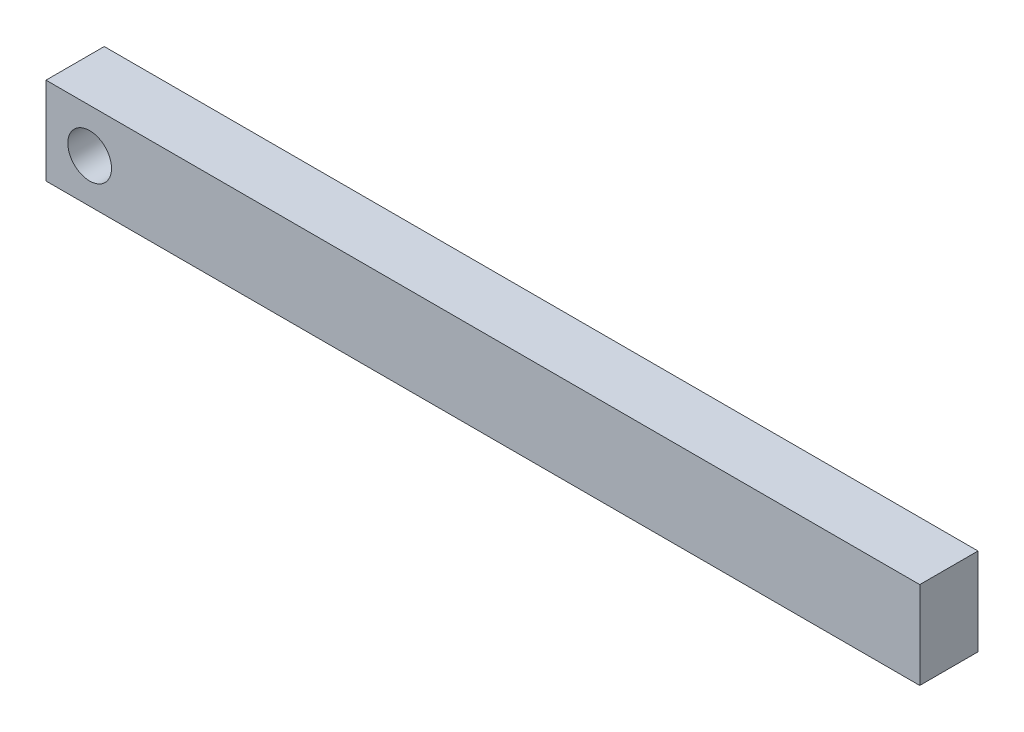
ISO-10303-21;
HEADER;
FILE_DESCRIPTION(('STEP AP214'),'2;1');
FILE_NAME('part.step','',(''),(''),'','','');
FILE_SCHEMA(('AUTOMOTIVE_DESIGN { 1 0 10303 214 1 1 1 1 }'));
ENDSEC;
DATA;
#1=APPLICATION_CONTEXT('core data for automotive mechanical design processes');
#2=APPLICATION_PROTOCOL_DEFINITION('international standard','automotive_design',2000,#1);
#3=PRODUCT_CONTEXT('',#1,'mechanical');
#4=PRODUCT('Part','Part','',(#3));
#5=PRODUCT_RELATED_PRODUCT_CATEGORY('part','',(#4));
#6=PRODUCT_DEFINITION_FORMATION('','',#4);
#7=PRODUCT_DEFINITION_CONTEXT('part definition',#1,'design');
#8=PRODUCT_DEFINITION('design','',#6,#7);
#9=PRODUCT_DEFINITION_SHAPE('','',#8);
#10=(LENGTH_UNIT() NAMED_UNIT(*) SI_UNIT(.MILLI.,.METRE.));
#11=(NAMED_UNIT(*) PLANE_ANGLE_UNIT() SI_UNIT($,.RADIAN.));
#12=(NAMED_UNIT(*) SI_UNIT($,.STERADIAN.) SOLID_ANGLE_UNIT());
#13=UNCERTAINTY_MEASURE_WITH_UNIT(LENGTH_MEASURE(1.E-05),#10,'distance_accuracy_value','');
#14=(GEOMETRIC_REPRESENTATION_CONTEXT(3) GLOBAL_UNCERTAINTY_ASSIGNED_CONTEXT((#13)) GLOBAL_UNIT_ASSIGNED_CONTEXT((#10,
#11,#12)) REPRESENTATION_CONTEXT('',''));
#15=CARTESIAN_POINT('',(0.,0.,0.));
#16=DIRECTION('',(0.,0.,1.));
#17=DIRECTION('',(1.,0.,0.));
#18=AXIS2_PLACEMENT_3D('',#15,#16,#17);
#19=CARTESIAN_POINT('',(-381.,-38.1000000000001,50.8));
#20=DIRECTION('',(1.,0.,0.));
#21=DIRECTION('',(0.,0.,-1.));
#22=AXIS2_PLACEMENT_3D('',#19,#20,#21);
#23=PLANE('',#22);
#24=DIRECTION('',(0.,-1.,0.));
#25=VECTOR('',#24,1.);
#26=CARTESIAN_POINT('',(-381.,-38.1000000000001,0.));
#27=LINE('',#26,#25);
#28=CARTESIAN_POINT('',(-381.,38.1,0.));
#29=VERTEX_POINT('',#28);
#30=CARTESIAN_POINT('',(-381.,-38.1000000000001,0.));
#31=VERTEX_POINT('',#30);
#32=EDGE_CURVE('E96',#29,#31,#27,.T.);
#33=ORIENTED_EDGE('',*,*,#32,.T.);
#34=DIRECTION('',(0.,0.,-1.));
#35=VECTOR('',#34,1.);
#36=CARTESIAN_POINT('',(-381.,-38.1000000000001,50.8));
#37=LINE('',#36,#35);
#38=CARTESIAN_POINT('',(-381.,-38.1000000000001,50.8));
#39=VERTEX_POINT('',#38);
#40=EDGE_CURVE('E11',#39,#31,#37,.T.);
#41=ORIENTED_EDGE('',*,*,#40,.F.);
#42=DIRECTION('',(0.,-1.,0.));
#43=VECTOR('',#42,1.);
#44=CARTESIAN_POINT('',(-381.,-38.1000000000001,50.8));
#45=LINE('',#44,#43);
#46=CARTESIAN_POINT('',(-381.,38.1,50.8));
#47=VERTEX_POINT('',#46);
#48=EDGE_CURVE('E84',#47,#39,#45,.T.);
#49=ORIENTED_EDGE('',*,*,#48,.F.);
#50=DIRECTION('',(0.,0.,-1.));
#51=VECTOR('',#50,1.);
#52=CARTESIAN_POINT('',(-381.,38.1,50.8));
#53=LINE('',#52,#51);
#54=EDGE_CURVE('E92',#47,#29,#53,.T.);
#55=ORIENTED_EDGE('',*,*,#54,.T.);
#56=EDGE_LOOP('',(#33,#41,#49,#55));
#57=FACE_BOUND('',#56,.T.);
#58=ADVANCED_FACE('F33',(#57),#23,.F.);
#59=CARTESIAN_POINT('',(381.,-38.0999999999999,50.8));
#60=DIRECTION('',(0.,1.,0.));
#61=DIRECTION('',(-1.,0.,0.));
#62=AXIS2_PLACEMENT_3D('',#59,#60,#61);
#63=PLANE('',#62);
#64=DIRECTION('',(1.,0.,0.));
#65=VECTOR('',#64,1.);
#66=CARTESIAN_POINT('',(381.,-38.0999999999999,0.));
#67=LINE('',#66,#65);
#68=CARTESIAN_POINT('',(381.,-38.0999999999999,0.));
#69=VERTEX_POINT('',#68);
#70=EDGE_CURVE('E88',#31,#69,#67,.T.);
#71=ORIENTED_EDGE('',*,*,#70,.T.);
#72=DIRECTION('',(0.,0.,-1.));
#73=VECTOR('',#72,1.);
#74=CARTESIAN_POINT('',(381.,-38.0999999999999,50.8));
#75=LINE('',#74,#73);
#76=CARTESIAN_POINT('',(381.,-38.0999999999999,50.8));
#77=VERTEX_POINT('',#76);
#78=EDGE_CURVE('E41',#77,#69,#75,.T.);
#79=ORIENTED_EDGE('',*,*,#78,.F.);
#80=DIRECTION('',(1.,0.,0.));
#81=VECTOR('',#80,1.);
#82=CARTESIAN_POINT('',(381.,-38.0999999999999,50.8));
#83=LINE('',#82,#81);
#84=EDGE_CURVE('E79',#39,#77,#83,.T.);
#85=ORIENTED_EDGE('',*,*,#84,.F.);
#86=ORIENTED_EDGE('',*,*,#40,.T.);
#87=EDGE_LOOP('',(#71,#79,#85,#86));
#88=FACE_BOUND('',#87,.T.);
#89=ADVANCED_FACE('F87',(#88),#63,.F.);
#90=CARTESIAN_POINT('',(381.,-38.0999999999999,50.8));
#91=DIRECTION('',(-1.,0.,0.));
#92=DIRECTION('',(0.,0.,1.));
#93=AXIS2_PLACEMENT_3D('',#90,#91,#92);
#94=PLANE('',#93);
#95=DIRECTION('',(0.,1.,0.));
#96=VECTOR('',#95,1.);
#97=CARTESIAN_POINT('',(381.,-38.0999999999999,0.));
#98=LINE('',#97,#96);
#99=CARTESIAN_POINT('',(381.,38.1000000000001,0.));
#100=VERTEX_POINT('',#99);
#101=EDGE_CURVE('E66',#69,#100,#98,.T.);
#102=ORIENTED_EDGE('',*,*,#101,.T.);
#103=DIRECTION('',(0.,0.,-1.));
#104=VECTOR('',#103,1.);
#105=CARTESIAN_POINT('',(381.,38.1000000000001,50.8));
#106=LINE('',#105,#104);
#107=CARTESIAN_POINT('',(381.,38.1000000000001,50.8));
#108=VERTEX_POINT('',#107);
#109=EDGE_CURVE('E89',#108,#100,#106,.T.);
#110=ORIENTED_EDGE('',*,*,#109,.F.);
#111=DIRECTION('',(0.,1.,0.));
#112=VECTOR('',#111,1.);
#113=CARTESIAN_POINT('',(381.,-38.0999999999999,50.8));
#114=LINE('',#113,#112);
#115=EDGE_CURVE('E82',#77,#108,#114,.T.);
#116=ORIENTED_EDGE('',*,*,#115,.F.);
#117=ORIENTED_EDGE('',*,*,#78,.T.);
#118=EDGE_LOOP('',(#102,#110,#116,#117));
#119=FACE_BOUND('',#118,.T.);
#120=ADVANCED_FACE('F90',(#119),#94,.F.);
#121=CARTESIAN_POINT('',(381.,38.1000000000001,50.8));
#122=DIRECTION('',(0.,-1.,0.));
#123=DIRECTION('',(1.,0.,0.));
#124=AXIS2_PLACEMENT_3D('',#121,#122,#123);
#125=PLANE('',#124);
#126=DIRECTION('',(-1.,0.,0.));
#127=VECTOR('',#126,1.);
#128=CARTESIAN_POINT('',(381.,38.1000000000001,0.));
#129=LINE('',#128,#127);
#130=EDGE_CURVE('E72',#100,#29,#129,.T.);
#131=ORIENTED_EDGE('',*,*,#130,.T.);
#132=ORIENTED_EDGE('',*,*,#54,.F.);
#133=DIRECTION('',(-1.,0.,0.));
#134=VECTOR('',#133,1.);
#135=CARTESIAN_POINT('',(381.,38.1000000000001,50.8));
#136=LINE('',#135,#134);
#137=EDGE_CURVE('E49',#108,#47,#136,.T.);
#138=ORIENTED_EDGE('',*,*,#137,.F.);
#139=ORIENTED_EDGE('',*,*,#109,.T.);
#140=EDGE_LOOP('',(#131,#132,#138,#139));
#141=FACE_BOUND('',#140,.T.);
#142=ADVANCED_FACE('F104',(#141),#125,.F.);
#143=CARTESIAN_POINT('',(0.,0.,50.8));
#144=DIRECTION('',(0.,0.,1.));
#145=DIRECTION('',(1.,0.,0.));
#146=AXIS2_PLACEMENT_3D('',#143,#144,#145);
#147=PLANE('',#146);
#148=CARTESIAN_POINT('',(-342.9,0.,50.8));
#149=DIRECTION('',(0.,0.,1.));
#150=DIRECTION('',(1.,0.,0.));
#151=AXIS2_PLACEMENT_3D('',#148,#149,#150);
#152=CIRCLE('',#151,19.05);
#153=CARTESIAN_POINT('',(-323.85,0.,50.8));
#154=VERTEX_POINT('',#153);
#155=EDGE_CURVE('E99',#154,#154,#152,.T.);
#156=ORIENTED_EDGE('',*,*,#155,.F.);
#157=EDGE_LOOP('',(#156));
#158=FACE_BOUND('',#157,.T.);
#159=ORIENTED_EDGE('',*,*,#48,.T.);
#160=ORIENTED_EDGE('',*,*,#84,.T.);
#161=ORIENTED_EDGE('',*,*,#115,.T.);
#162=ORIENTED_EDGE('',*,*,#137,.T.);
#163=EDGE_LOOP('',(#159,#160,#161,#162));
#164=FACE_BOUND('',#163,.T.);
#165=ADVANCED_FACE('F80',(#158,#164),#147,.T.);
#166=CARTESIAN_POINT('',(0.,0.,0.));
#167=DIRECTION('',(0.,0.,1.));
#168=DIRECTION('',(1.,0.,0.));
#169=AXIS2_PLACEMENT_3D('',#166,#167,#168);
#170=PLANE('',#169);
#171=CARTESIAN_POINT('',(-342.9,0.,0.));
#172=DIRECTION('',(0.,0.,1.));
#173=DIRECTION('',(1.,0.,0.));
#174=AXIS2_PLACEMENT_3D('',#171,#172,#173);
#175=CIRCLE('',#174,19.05);
#176=CARTESIAN_POINT('',(-323.85,0.,0.));
#177=VERTEX_POINT('',#176);
#178=EDGE_CURVE('E110',#177,#177,#175,.T.);
#179=ORIENTED_EDGE('',*,*,#178,.T.);
#180=EDGE_LOOP('',(#179));
#181=FACE_BOUND('',#180,.T.);
#182=ORIENTED_EDGE('',*,*,#32,.F.);
#183=ORIENTED_EDGE('',*,*,#130,.F.);
#184=ORIENTED_EDGE('',*,*,#101,.F.);
#185=ORIENTED_EDGE('',*,*,#70,.F.);
#186=EDGE_LOOP('',(#182,#183,#184,#185));
#187=FACE_BOUND('',#186,.T.);
#188=ADVANCED_FACE('F107',(#181,#187),#170,.F.);
#189=CARTESIAN_POINT('',(-342.9,0.,50.8));
#190=DIRECTION('',(0.,0.,-1.));
#191=DIRECTION('',(-1.,0.,0.));
#192=AXIS2_PLACEMENT_3D('',#189,#190,#191);
#193=CYLINDRICAL_SURFACE('',#192,19.05);
#194=ORIENTED_EDGE('',*,*,#155,.T.);
#195=EDGE_LOOP('',(#194));
#196=FACE_BOUND('',#195,.T.);
#197=ORIENTED_EDGE('',*,*,#178,.F.);
#198=EDGE_LOOP('',(#197));
#199=FACE_BOUND('',#198,.T.);
#200=ADVANCED_FACE('F116',(#196,#199),#193,.F.);
#201=CLOSED_SHELL('',(#58,#89,#120,#142,#165,#188,#200));
#202=MANIFOLD_SOLID_BREP('B2',#201);
#203=ADVANCED_BREP_SHAPE_REPRESENTATION('',(#18,#202),#14);
#204=SHAPE_DEFINITION_REPRESENTATION(#9,#203);
ENDSEC;
END-ISO-10303-21;
